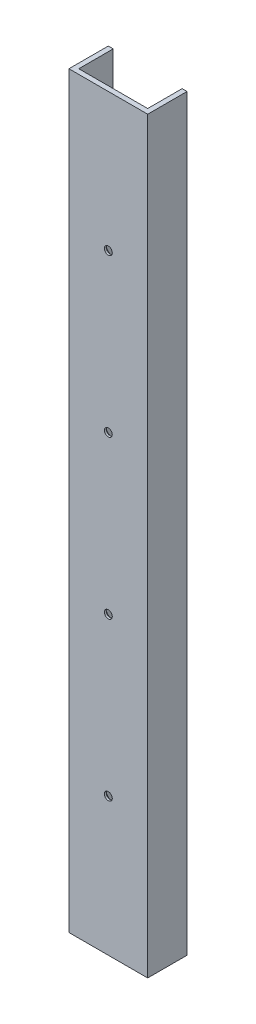
ISO-10303-21;
HEADER;
FILE_DESCRIPTION(('STEP AP214'),'2;1');
FILE_NAME('part.step','',(''),(''),'','','');
FILE_SCHEMA(('AUTOMOTIVE_DESIGN { 1 0 10303 214 1 1 1 1 }'));
ENDSEC;
DATA;
#1=APPLICATION_CONTEXT('core data for automotive mechanical design processes');
#2=APPLICATION_PROTOCOL_DEFINITION('international standard','automotive_design',2000,#1);
#3=PRODUCT_CONTEXT('',#1,'mechanical');
#4=PRODUCT('Part','Part','',(#3));
#5=PRODUCT_RELATED_PRODUCT_CATEGORY('part','',(#4));
#6=PRODUCT_DEFINITION_FORMATION('','',#4);
#7=PRODUCT_DEFINITION_CONTEXT('part definition',#1,'design');
#8=PRODUCT_DEFINITION('design','',#6,#7);
#9=PRODUCT_DEFINITION_SHAPE('','',#8);
#10=(LENGTH_UNIT() NAMED_UNIT(*) SI_UNIT(.MILLI.,.METRE.));
#11=(NAMED_UNIT(*) PLANE_ANGLE_UNIT() SI_UNIT($,.RADIAN.));
#12=(NAMED_UNIT(*) SI_UNIT($,.STERADIAN.) SOLID_ANGLE_UNIT());
#13=UNCERTAINTY_MEASURE_WITH_UNIT(LENGTH_MEASURE(1.E-05),#10,'distance_accuracy_value','');
#14=(GEOMETRIC_REPRESENTATION_CONTEXT(3) GLOBAL_UNCERTAINTY_ASSIGNED_CONTEXT((#13)) GLOBAL_UNIT_ASSIGNED_CONTEXT((#10,
#11,#12)) REPRESENTATION_CONTEXT('',''));
#15=CARTESIAN_POINT('',(0.,0.,0.));
#16=DIRECTION('',(0.,0.,1.));
#17=DIRECTION('',(1.,0.,0.));
#18=AXIS2_PLACEMENT_3D('',#15,#16,#17);
#19=CARTESIAN_POINT('',(-22.2249999999998,241.3,-12.7));
#20=DIRECTION('',(0.,0.,1.));
#21=DIRECTION('',(1.,0.,0.));
#22=AXIS2_PLACEMENT_3D('',#19,#20,#21);
#23=PLANE('',#22);
#24=DIRECTION('',(-1.,0.,0.));
#25=VECTOR('',#24,1.);
#26=CARTESIAN_POINT('',(-22.2250000000002,-241.3,-12.6999999999999));
#27=LINE('',#26,#25);
#28=CARTESIAN_POINT('',(-22.2250000000002,-241.3,-12.6999999999999));
#29=VERTEX_POINT('',#28);
#30=CARTESIAN_POINT('',(-25.4000000000002,-241.3,-12.6999999999999));
#31=VERTEX_POINT('',#30);
#32=EDGE_CURVE('E150',#29,#31,#27,.T.);
#33=ORIENTED_EDGE('',*,*,#32,.T.);
#34=DIRECTION('',(0.,-1.,0.));
#35=VECTOR('',#34,1.);
#36=CARTESIAN_POINT('',(-25.3999999999998,241.3,-12.7));
#37=LINE('',#36,#35);
#38=CARTESIAN_POINT('',(-25.3999999999998,241.3,-12.7));
#39=VERTEX_POINT('',#38);
#40=EDGE_CURVE('E11',#39,#31,#37,.T.);
#41=ORIENTED_EDGE('',*,*,#40,.F.);
#42=DIRECTION('',(-1.,0.,0.));
#43=VECTOR('',#42,1.);
#44=CARTESIAN_POINT('',(-22.2249999999998,241.3,-12.7));
#45=LINE('',#44,#43);
#46=CARTESIAN_POINT('',(-22.2249999999998,241.3,-12.7));
#47=VERTEX_POINT('',#46);
#48=EDGE_CURVE('E173',#47,#39,#45,.T.);
#49=ORIENTED_EDGE('',*,*,#48,.F.);
#50=DIRECTION('',(0.,-1.,0.));
#51=VECTOR('',#50,1.);
#52=CARTESIAN_POINT('',(-22.2249999999998,241.3,-12.7));
#53=LINE('',#52,#51);
#54=EDGE_CURVE('E146',#47,#29,#53,.T.);
#55=ORIENTED_EDGE('',*,*,#54,.T.);
#56=EDGE_LOOP('',(#33,#41,#49,#55));
#57=FACE_BOUND('',#56,.T.);
#58=ADVANCED_FACE('F48',(#57),#23,.F.);
#59=CARTESIAN_POINT('',(-25.3999999999998,241.3,-12.7));
#60=DIRECTION('',(1.,0.,0.));
#61=DIRECTION('',(0.,0.,-1.));
#62=AXIS2_PLACEMENT_3D('',#59,#60,#61);
#63=PLANE('',#62);
#64=DIRECTION('',(0.,0.,1.));
#65=VECTOR('',#64,1.);
#66=CARTESIAN_POINT('',(-25.4000000000002,-241.3,-12.6999999999999));
#67=LINE('',#66,#65);
#68=CARTESIAN_POINT('',(-25.4000000000002,-241.3,12.7));
#69=VERTEX_POINT('',#68);
#70=EDGE_CURVE('E154',#31,#69,#67,.T.);
#71=ORIENTED_EDGE('',*,*,#70,.T.);
#72=DIRECTION('',(0.,-1.,0.));
#73=VECTOR('',#72,1.);
#74=CARTESIAN_POINT('',(-25.3999999999998,241.3,12.6999999999999));
#75=LINE('',#74,#73);
#76=CARTESIAN_POINT('',(-25.3999999999998,241.3,12.6999999999999));
#77=VERTEX_POINT('',#76);
#78=EDGE_CURVE('E57',#77,#69,#75,.T.);
#79=ORIENTED_EDGE('',*,*,#78,.F.);
#80=DIRECTION('',(0.,0.,1.));
#81=VECTOR('',#80,1.);
#82=CARTESIAN_POINT('',(-25.3999999999998,241.3,-12.7));
#83=LINE('',#82,#81);
#84=EDGE_CURVE('E108',#39,#77,#83,.T.);
#85=ORIENTED_EDGE('',*,*,#84,.F.);
#86=ORIENTED_EDGE('',*,*,#40,.T.);
#87=EDGE_LOOP('',(#71,#79,#85,#86));
#88=FACE_BOUND('',#87,.T.);
#89=ADVANCED_FACE('F297',(#88),#63,.F.);
#90=CARTESIAN_POINT('',(-25.3999999999998,241.3,12.6999999999999));
#91=DIRECTION('',(0.,0.,-1.));
#92=DIRECTION('',(-1.,0.,0.));
#93=AXIS2_PLACEMENT_3D('',#90,#91,#92);
#94=PLANE('',#93);
#95=CARTESIAN_POINT('',(0.,152.4,12.7));
#96=DIRECTION('',(0.,0.,-1.));
#97=DIRECTION('',(-1.,0.,0.));
#98=AXIS2_PLACEMENT_3D('',#95,#96,#97);
#99=CIRCLE('',#98,2.5527);
#100=CARTESIAN_POINT('',(-2.5527,152.4,12.7));
#101=VERTEX_POINT('',#100);
#102=EDGE_CURVE('E254',#101,#101,#99,.T.);
#103=ORIENTED_EDGE('',*,*,#102,.T.);
#104=EDGE_LOOP('',(#103));
#105=FACE_BOUND('',#104,.T.);
#106=CARTESIAN_POINT('',(0.,50.8000000000001,12.7));
#107=DIRECTION('',(0.,0.,-1.));
#108=DIRECTION('',(-1.,0.,0.));
#109=AXIS2_PLACEMENT_3D('',#106,#107,#108);
#110=CIRCLE('',#109,2.5527);
#111=CARTESIAN_POINT('',(-2.5527,50.8000000000001,12.7));
#112=VERTEX_POINT('',#111);
#113=EDGE_CURVE('E242',#112,#112,#110,.T.);
#114=ORIENTED_EDGE('',*,*,#113,.T.);
#115=EDGE_LOOP('',(#114));
#116=FACE_BOUND('',#115,.T.);
#117=CARTESIAN_POINT('',(0.,-50.7999999999999,12.6999999999999));
#118=DIRECTION('',(0.,0.,-1.));
#119=DIRECTION('',(-1.,0.,0.));
#120=AXIS2_PLACEMENT_3D('',#117,#118,#119);
#121=CIRCLE('',#120,2.5527);
#122=CARTESIAN_POINT('',(-2.5527,-50.7999999999999,12.6999999999999));
#123=VERTEX_POINT('',#122);
#124=EDGE_CURVE('E230',#123,#123,#121,.T.);
#125=ORIENTED_EDGE('',*,*,#124,.T.);
#126=EDGE_LOOP('',(#125));
#127=FACE_BOUND('',#126,.T.);
#128=CARTESIAN_POINT('',(0.,-152.4,12.7));
#129=DIRECTION('',(0.,0.,-1.));
#130=DIRECTION('',(-1.,0.,0.));
#131=AXIS2_PLACEMENT_3D('',#128,#129,#130);
#132=CIRCLE('',#131,2.5527);
#133=CARTESIAN_POINT('',(-2.5527,-152.4,12.7));
#134=VERTEX_POINT('',#133);
#135=EDGE_CURVE('E155',#134,#134,#132,.T.);
#136=ORIENTED_EDGE('',*,*,#135,.T.);
#137=EDGE_LOOP('',(#136));
#138=FACE_BOUND('',#137,.T.);
#139=DIRECTION('',(1.,0.,0.));
#140=VECTOR('',#139,1.);
#141=CARTESIAN_POINT('',(-25.4000000000002,-241.3,12.7));
#142=LINE('',#141,#140);
#143=CARTESIAN_POINT('',(25.4000000000002,-241.3,12.7));
#144=VERTEX_POINT('',#143);
#145=EDGE_CURVE('E158',#69,#144,#142,.T.);
#146=ORIENTED_EDGE('',*,*,#145,.T.);
#147=DIRECTION('',(0.,-1.,0.));
#148=VECTOR('',#147,1.);
#149=CARTESIAN_POINT('',(25.3999999999998,241.3,12.6999999999999));
#150=LINE('',#149,#148);
#151=CARTESIAN_POINT('',(25.3999999999998,241.3,12.6999999999999));
#152=VERTEX_POINT('',#151);
#153=EDGE_CURVE('E184',#152,#144,#150,.T.);
#154=ORIENTED_EDGE('',*,*,#153,.F.);
#155=DIRECTION('',(1.,0.,0.));
#156=VECTOR('',#155,1.);
#157=CARTESIAN_POINT('',(-25.3999999999998,241.3,12.6999999999999));
#158=LINE('',#157,#156);
#159=EDGE_CURVE('E195',#77,#152,#158,.T.);
#160=ORIENTED_EDGE('',*,*,#159,.F.);
#161=ORIENTED_EDGE('',*,*,#78,.T.);
#162=EDGE_LOOP('',(#146,#154,#160,#161));
#163=FACE_BOUND('',#162,.T.);
#164=ADVANCED_FACE('F193',(#105,#116,#127,#138,#163),#94,.F.);
#165=CARTESIAN_POINT('',(25.3999999999998,241.3,12.6999999999999));
#166=DIRECTION('',(-1.,0.,0.));
#167=DIRECTION('',(0.,0.,1.));
#168=AXIS2_PLACEMENT_3D('',#165,#166,#167);
#169=PLANE('',#168);
#170=DIRECTION('',(0.,0.,-1.));
#171=VECTOR('',#170,1.);
#172=CARTESIAN_POINT('',(25.4000000000002,-241.3,12.7));
#173=LINE('',#172,#171);
#174=CARTESIAN_POINT('',(25.4000000000002,-241.3,-12.6999999999999));
#175=VERTEX_POINT('',#174);
#176=EDGE_CURVE('E161',#144,#175,#173,.T.);
#177=ORIENTED_EDGE('',*,*,#176,.T.);
#178=DIRECTION('',(0.,-1.,0.));
#179=VECTOR('',#178,1.);
#180=CARTESIAN_POINT('',(25.3999999999998,241.3,-12.7));
#181=LINE('',#180,#179);
#182=CARTESIAN_POINT('',(25.3999999999998,241.3,-12.7));
#183=VERTEX_POINT('',#182);
#184=EDGE_CURVE('E180',#183,#175,#181,.T.);
#185=ORIENTED_EDGE('',*,*,#184,.F.);
#186=DIRECTION('',(0.,0.,-1.));
#187=VECTOR('',#186,1.);
#188=CARTESIAN_POINT('',(25.3999999999998,241.3,12.6999999999999));
#189=LINE('',#188,#187);
#190=EDGE_CURVE('E208',#152,#183,#189,.T.);
#191=ORIENTED_EDGE('',*,*,#190,.F.);
#192=ORIENTED_EDGE('',*,*,#153,.T.);
#193=EDGE_LOOP('',(#177,#185,#191,#192));
#194=FACE_BOUND('',#193,.T.);
#195=ADVANCED_FACE('F203',(#194),#169,.F.);
#196=CARTESIAN_POINT('',(25.3999999999998,241.3,-12.7));
#197=DIRECTION('',(0.,0.,1.));
#198=DIRECTION('',(1.,0.,0.));
#199=AXIS2_PLACEMENT_3D('',#196,#197,#198);
#200=PLANE('',#199);
#201=DIRECTION('',(-1.,0.,0.));
#202=VECTOR('',#201,1.);
#203=CARTESIAN_POINT('',(25.4000000000002,-241.3,-12.6999999999999));
#204=LINE('',#203,#202);
#205=CARTESIAN_POINT('',(22.2250000000002,-241.3,-12.6999999999999));
#206=VERTEX_POINT('',#205);
#207=EDGE_CURVE('E164',#175,#206,#204,.T.);
#208=ORIENTED_EDGE('',*,*,#207,.T.);
#209=DIRECTION('',(0.,-1.,0.));
#210=VECTOR('',#209,1.);
#211=CARTESIAN_POINT('',(22.2249999999998,241.3,-12.7));
#212=LINE('',#211,#210);
#213=CARTESIAN_POINT('',(22.2249999999998,241.3,-12.7));
#214=VERTEX_POINT('',#213);
#215=EDGE_CURVE('E138',#214,#206,#212,.T.);
#216=ORIENTED_EDGE('',*,*,#215,.F.);
#217=DIRECTION('',(-1.,0.,0.));
#218=VECTOR('',#217,1.);
#219=CARTESIAN_POINT('',(25.3999999999998,241.3,-12.7));
#220=LINE('',#219,#218);
#221=EDGE_CURVE('E127',#183,#214,#220,.T.);
#222=ORIENTED_EDGE('',*,*,#221,.F.);
#223=ORIENTED_EDGE('',*,*,#184,.T.);
#224=EDGE_LOOP('',(#208,#216,#222,#223));
#225=FACE_BOUND('',#224,.T.);
#226=ADVANCED_FACE('F206',(#225),#200,.F.);
#227=CARTESIAN_POINT('',(22.2249999999998,241.3,-12.7));
#228=DIRECTION('',(1.,0.,0.));
#229=DIRECTION('',(0.,0.,-1.));
#230=AXIS2_PLACEMENT_3D('',#227,#228,#229);
#231=PLANE('',#230);
#232=DIRECTION('',(0.,0.,1.));
#233=VECTOR('',#232,1.);
#234=CARTESIAN_POINT('',(22.2250000000002,-241.3,-12.6999999999999));
#235=LINE('',#234,#233);
#236=CARTESIAN_POINT('',(22.2250000000002,-241.3,9.52500000000001));
#237=VERTEX_POINT('',#236);
#238=EDGE_CURVE('E136',#206,#237,#235,.T.);
#239=ORIENTED_EDGE('',*,*,#238,.T.);
#240=DIRECTION('',(0.,-1.,0.));
#241=VECTOR('',#240,1.);
#242=CARTESIAN_POINT('',(22.2249999999998,241.3,9.52500000000001));
#243=LINE('',#242,#241);
#244=CARTESIAN_POINT('',(22.2249999999998,241.3,9.52500000000001));
#245=VERTEX_POINT('',#244);
#246=EDGE_CURVE('E133',#245,#237,#243,.T.);
#247=ORIENTED_EDGE('',*,*,#246,.F.);
#248=DIRECTION('',(0.,0.,1.));
#249=VECTOR('',#248,1.);
#250=CARTESIAN_POINT('',(22.2249999999998,241.3,-12.7));
#251=LINE('',#250,#249);
#252=EDGE_CURVE('E121',#214,#245,#251,.T.);
#253=ORIENTED_EDGE('',*,*,#252,.F.);
#254=ORIENTED_EDGE('',*,*,#215,.T.);
#255=EDGE_LOOP('',(#239,#247,#253,#254));
#256=FACE_BOUND('',#255,.T.);
#257=ADVANCED_FACE('F134',(#256),#231,.F.);
#258=CARTESIAN_POINT('',(22.2249999999998,241.3,9.52500000000001));
#259=DIRECTION('',(0.,0.,1.));
#260=DIRECTION('',(1.,0.,0.));
#261=AXIS2_PLACEMENT_3D('',#258,#259,#260);
#262=PLANE('',#261);
#263=CARTESIAN_POINT('',(0.,152.4,9.52500000000001));
#264=DIRECTION('',(0.,0.,-1.));
#265=DIRECTION('',(-1.,0.,0.));
#266=AXIS2_PLACEMENT_3D('',#263,#264,#265);
#267=CIRCLE('',#266,4.8895);
#268=CARTESIAN_POINT('',(-4.8895,152.4,9.52500000000001));
#269=VERTEX_POINT('',#268);
#270=EDGE_CURVE('E262',#269,#269,#267,.T.);
#271=ORIENTED_EDGE('',*,*,#270,.F.);
#272=EDGE_LOOP('',(#271));
#273=FACE_BOUND('',#272,.T.);
#274=CARTESIAN_POINT('',(0.,50.8000000000001,9.52500000000001));
#275=DIRECTION('',(0.,0.,-1.));
#276=DIRECTION('',(-1.,0.,0.));
#277=AXIS2_PLACEMENT_3D('',#274,#275,#276);
#278=CIRCLE('',#277,4.8895);
#279=CARTESIAN_POINT('',(-4.8895,50.8000000000001,9.52500000000001));
#280=VERTEX_POINT('',#279);
#281=EDGE_CURVE('E250',#280,#280,#278,.T.);
#282=ORIENTED_EDGE('',*,*,#281,.F.);
#283=EDGE_LOOP('',(#282));
#284=FACE_BOUND('',#283,.T.);
#285=CARTESIAN_POINT('',(0.,-50.7999999999999,9.52500000000001));
#286=DIRECTION('',(0.,0.,-1.));
#287=DIRECTION('',(-1.,0.,0.));
#288=AXIS2_PLACEMENT_3D('',#285,#286,#287);
#289=CIRCLE('',#288,4.8895);
#290=CARTESIAN_POINT('',(-4.8895,-50.7999999999999,9.52500000000001));
#291=VERTEX_POINT('',#290);
#292=EDGE_CURVE('E238',#291,#291,#289,.T.);
#293=ORIENTED_EDGE('',*,*,#292,.F.);
#294=EDGE_LOOP('',(#293));
#295=FACE_BOUND('',#294,.T.);
#296=CARTESIAN_POINT('',(0.,-152.4,9.52500000000001));
#297=DIRECTION('',(0.,0.,-1.));
#298=DIRECTION('',(-1.,0.,0.));
#299=AXIS2_PLACEMENT_3D('',#296,#297,#298);
#300=CIRCLE('',#299,4.8895);
#301=CARTESIAN_POINT('',(-4.8895,-152.4,9.52500000000001));
#302=VERTEX_POINT('',#301);
#303=EDGE_CURVE('E226',#302,#302,#300,.T.);
#304=ORIENTED_EDGE('',*,*,#303,.F.);
#305=EDGE_LOOP('',(#304));
#306=FACE_BOUND('',#305,.T.);
#307=DIRECTION('',(-1.,0.,0.));
#308=VECTOR('',#307,1.);
#309=CARTESIAN_POINT('',(22.2250000000002,-241.3,9.52500000000001));
#310=LINE('',#309,#308);
#311=CARTESIAN_POINT('',(-22.2250000000002,-241.3,9.52500000000001));
#312=VERTEX_POINT('',#311);
#313=EDGE_CURVE('E94',#237,#312,#310,.T.);
#314=ORIENTED_EDGE('',*,*,#313,.T.);
#315=DIRECTION('',(0.,-1.,0.));
#316=VECTOR('',#315,1.);
#317=CARTESIAN_POINT('',(-22.2249999999998,241.3,9.52500000000001));
#318=LINE('',#317,#316);
#319=CARTESIAN_POINT('',(-22.2249999999998,241.3,9.52500000000001));
#320=VERTEX_POINT('',#319);
#321=EDGE_CURVE('E139',#320,#312,#318,.T.);
#322=ORIENTED_EDGE('',*,*,#321,.F.);
#323=DIRECTION('',(-1.,0.,0.));
#324=VECTOR('',#323,1.);
#325=CARTESIAN_POINT('',(22.2249999999998,241.3,9.52500000000001));
#326=LINE('',#325,#324);
#327=EDGE_CURVE('E125',#245,#320,#326,.T.);
#328=ORIENTED_EDGE('',*,*,#327,.F.);
#329=ORIENTED_EDGE('',*,*,#246,.T.);
#330=EDGE_LOOP('',(#314,#322,#328,#329));
#331=FACE_BOUND('',#330,.T.);
#332=ADVANCED_FACE('F141',(#273,#284,#295,#306,#331),#262,.F.);
#333=CARTESIAN_POINT('',(-22.2249999999998,241.3,9.52500000000001));
#334=DIRECTION('',(-1.,0.,0.));
#335=DIRECTION('',(0.,0.,1.));
#336=AXIS2_PLACEMENT_3D('',#333,#334,#335);
#337=PLANE('',#336);
#338=DIRECTION('',(0.,0.,-1.));
#339=VECTOR('',#338,1.);
#340=CARTESIAN_POINT('',(-22.2250000000002,-241.3,9.52500000000001));
#341=LINE('',#340,#339);
#342=EDGE_CURVE('E100',#312,#29,#341,.T.);
#343=ORIENTED_EDGE('',*,*,#342,.T.);
#344=ORIENTED_EDGE('',*,*,#54,.F.);
#345=DIRECTION('',(0.,0.,-1.));
#346=VECTOR('',#345,1.);
#347=CARTESIAN_POINT('',(-22.2249999999998,241.3,9.52500000000001));
#348=LINE('',#347,#346);
#349=EDGE_CURVE('E65',#320,#47,#348,.T.);
#350=ORIENTED_EDGE('',*,*,#349,.F.);
#351=ORIENTED_EDGE('',*,*,#321,.T.);
#352=EDGE_LOOP('',(#343,#344,#350,#351));
#353=FACE_BOUND('',#352,.T.);
#354=ADVANCED_FACE('F272',(#353),#337,.F.);
#355=CARTESIAN_POINT('',(0.,241.3,0.));
#356=DIRECTION('',(0.,1.,0.));
#357=DIRECTION('',(0.,0.,1.));
#358=AXIS2_PLACEMENT_3D('',#355,#356,#357);
#359=PLANE('',#358);
#360=ORIENTED_EDGE('',*,*,#48,.T.);
#361=ORIENTED_EDGE('',*,*,#84,.T.);
#362=ORIENTED_EDGE('',*,*,#159,.T.);
#363=ORIENTED_EDGE('',*,*,#190,.T.);
#364=ORIENTED_EDGE('',*,*,#221,.T.);
#365=ORIENTED_EDGE('',*,*,#252,.T.);
#366=ORIENTED_EDGE('',*,*,#327,.T.);
#367=ORIENTED_EDGE('',*,*,#349,.T.);
#368=EDGE_LOOP('',(#360,#361,#362,#363,#364,#365,#366,#367));
#369=FACE_BOUND('',#368,.T.);
#370=ADVANCED_FACE('F123',(#369),#359,.T.);
#371=CARTESIAN_POINT('',(0.,-241.3,0.));
#372=DIRECTION('',(0.,1.,0.));
#373=DIRECTION('',(0.,0.,1.));
#374=AXIS2_PLACEMENT_3D('',#371,#372,#373);
#375=PLANE('',#374);
#376=ORIENTED_EDGE('',*,*,#32,.F.);
#377=ORIENTED_EDGE('',*,*,#342,.F.);
#378=ORIENTED_EDGE('',*,*,#313,.F.);
#379=ORIENTED_EDGE('',*,*,#238,.F.);
#380=ORIENTED_EDGE('',*,*,#207,.F.);
#381=ORIENTED_EDGE('',*,*,#176,.F.);
#382=ORIENTED_EDGE('',*,*,#145,.F.);
#383=ORIENTED_EDGE('',*,*,#70,.F.);
#384=EDGE_LOOP('',(#376,#377,#378,#379,#380,#381,#382,#383));
#385=FACE_BOUND('',#384,.T.);
#386=ADVANCED_FACE('F199',(#385),#375,.F.);
#387=CARTESIAN_POINT('',(0.,-152.4,9.52500000000001));
#388=DIRECTION('',(0.,0.,-1.));
#389=DIRECTION('',(-1.,0.,0.));
#390=AXIS2_PLACEMENT_3D('',#387,#388,#389);
#391=CYLINDRICAL_SURFACE('',#390,2.5527);
#392=ORIENTED_EDGE('',*,*,#135,.F.);
#393=EDGE_LOOP('',(#392));
#394=FACE_BOUND('',#393,.T.);
#395=CARTESIAN_POINT('',(0.,-152.4,11.485808018135));
#396=DIRECTION('',(0.,0.,-1.));
#397=DIRECTION('',(-1.,0.,0.));
#398=AXIS2_PLACEMENT_3D('',#395,#396,#397);
#399=CIRCLE('',#398,2.5527);
#400=CARTESIAN_POINT('',(-2.5527,-152.4,11.485808018135));
#401=VERTEX_POINT('',#400);
#402=EDGE_CURVE('E222',#401,#401,#399,.T.);
#403=ORIENTED_EDGE('',*,*,#402,.T.);
#404=EDGE_LOOP('',(#403));
#405=FACE_BOUND('',#404,.T.);
#406=ADVANCED_FACE('F283',(#394,#405),#391,.F.);
#407=CARTESIAN_POINT('',(0.,-152.4,9.52500000000001));
#408=DIRECTION('',(0.,0.,-1.));
#409=DIRECTION('',(-1.,0.,0.));
#410=AXIS2_PLACEMENT_3D('',#407,#408,#409);
#411=CONICAL_SURFACE('',#410,4.8895,0.872664625997165);
#412=ORIENTED_EDGE('',*,*,#402,.F.);
#413=EDGE_LOOP('',(#412));
#414=FACE_BOUND('',#413,.T.);
#415=ORIENTED_EDGE('',*,*,#303,.T.);
#416=EDGE_LOOP('',(#415));
#417=FACE_BOUND('',#416,.T.);
#418=ADVANCED_FACE('F280',(#414,#417),#411,.F.);
#419=CARTESIAN_POINT('',(0.,-50.7999999999999,9.52500000000001));
#420=DIRECTION('',(0.,0.,-1.));
#421=DIRECTION('',(-1.,0.,0.));
#422=AXIS2_PLACEMENT_3D('',#419,#420,#421);
#423=CYLINDRICAL_SURFACE('',#422,2.5527);
#424=ORIENTED_EDGE('',*,*,#124,.F.);
#425=EDGE_LOOP('',(#424));
#426=FACE_BOUND('',#425,.T.);
#427=CARTESIAN_POINT('',(0.,-50.7999999999999,11.485808018135));
#428=DIRECTION('',(0.,0.,-1.));
#429=DIRECTION('',(-1.,0.,0.));
#430=AXIS2_PLACEMENT_3D('',#427,#428,#429);
#431=CIRCLE('',#430,2.5527);
#432=CARTESIAN_POINT('',(-2.5527,-50.7999999999999,11.485808018135));
#433=VERTEX_POINT('',#432);
#434=EDGE_CURVE('E234',#433,#433,#431,.T.);
#435=ORIENTED_EDGE('',*,*,#434,.T.);
#436=EDGE_LOOP('',(#435));
#437=FACE_BOUND('',#436,.T.);
#438=ADVANCED_FACE('F282',(#426,#437),#423,.F.);
#439=CARTESIAN_POINT('',(0.,-50.7999999999999,9.52500000000001));
#440=DIRECTION('',(0.,0.,-1.));
#441=DIRECTION('',(-1.,0.,0.));
#442=AXIS2_PLACEMENT_3D('',#439,#440,#441);
#443=CONICAL_SURFACE('',#442,4.8895,0.872664625997165);
#444=ORIENTED_EDGE('',*,*,#434,.F.);
#445=EDGE_LOOP('',(#444));
#446=FACE_BOUND('',#445,.T.);
#447=ORIENTED_EDGE('',*,*,#292,.T.);
#448=EDGE_LOOP('',(#447));
#449=FACE_BOUND('',#448,.T.);
#450=ADVANCED_FACE('F290',(#446,#449),#443,.F.);
#451=CARTESIAN_POINT('',(0.,50.8000000000001,9.52500000000001));
#452=DIRECTION('',(0.,0.,-1.));
#453=DIRECTION('',(-1.,0.,0.));
#454=AXIS2_PLACEMENT_3D('',#451,#452,#453);
#455=CYLINDRICAL_SURFACE('',#454,2.5527);
#456=ORIENTED_EDGE('',*,*,#113,.F.);
#457=EDGE_LOOP('',(#456));
#458=FACE_BOUND('',#457,.T.);
#459=CARTESIAN_POINT('',(0.,50.8000000000001,11.4858080181351));
#460=DIRECTION('',(0.,0.,-1.));
#461=DIRECTION('',(-1.,0.,0.));
#462=AXIS2_PLACEMENT_3D('',#459,#460,#461);
#463=CIRCLE('',#462,2.5527);
#464=CARTESIAN_POINT('',(-2.5527,50.8000000000001,11.4858080181351));
#465=VERTEX_POINT('',#464);
#466=EDGE_CURVE('E246',#465,#465,#463,.T.);
#467=ORIENTED_EDGE('',*,*,#466,.T.);
#468=EDGE_LOOP('',(#467));
#469=FACE_BOUND('',#468,.T.);
#470=ADVANCED_FACE('F335',(#458,#469),#455,.F.);
#471=CARTESIAN_POINT('',(0.,50.8000000000001,9.52500000000001));
#472=DIRECTION('',(0.,0.,-1.));
#473=DIRECTION('',(-1.,0.,0.));
#474=AXIS2_PLACEMENT_3D('',#471,#472,#473);
#475=CONICAL_SURFACE('',#474,4.8895,0.872664625997165);
#476=ORIENTED_EDGE('',*,*,#466,.F.);
#477=EDGE_LOOP('',(#476));
#478=FACE_BOUND('',#477,.T.);
#479=ORIENTED_EDGE('',*,*,#281,.T.);
#480=EDGE_LOOP('',(#479));
#481=FACE_BOUND('',#480,.T.);
#482=ADVANCED_FACE('F340',(#478,#481),#475,.F.);
#483=CARTESIAN_POINT('',(0.,152.4,9.52500000000001));
#484=DIRECTION('',(0.,0.,-1.));
#485=DIRECTION('',(-1.,0.,0.));
#486=AXIS2_PLACEMENT_3D('',#483,#484,#485);
#487=CYLINDRICAL_SURFACE('',#486,2.5527);
#488=ORIENTED_EDGE('',*,*,#102,.F.);
#489=EDGE_LOOP('',(#488));
#490=FACE_BOUND('',#489,.T.);
#491=CARTESIAN_POINT('',(0.,152.4,11.485808018135));
#492=DIRECTION('',(0.,0.,-1.));
#493=DIRECTION('',(-1.,0.,0.));
#494=AXIS2_PLACEMENT_3D('',#491,#492,#493);
#495=CIRCLE('',#494,2.5527);
#496=CARTESIAN_POINT('',(-2.5527,152.4,11.485808018135));
#497=VERTEX_POINT('',#496);
#498=EDGE_CURVE('E258',#497,#497,#495,.T.);
#499=ORIENTED_EDGE('',*,*,#498,.T.);
#500=EDGE_LOOP('',(#499));
#501=FACE_BOUND('',#500,.T.);
#502=ADVANCED_FACE('F346',(#490,#501),#487,.F.);
#503=CARTESIAN_POINT('',(0.,152.4,9.52500000000001));
#504=DIRECTION('',(0.,0.,-1.));
#505=DIRECTION('',(-1.,0.,0.));
#506=AXIS2_PLACEMENT_3D('',#503,#504,#505);
#507=CONICAL_SURFACE('',#506,4.8895,0.872664625997165);
#508=ORIENTED_EDGE('',*,*,#498,.F.);
#509=EDGE_LOOP('',(#508));
#510=FACE_BOUND('',#509,.T.);
#511=ORIENTED_EDGE('',*,*,#270,.T.);
#512=EDGE_LOOP('',(#511));
#513=FACE_BOUND('',#512,.T.);
#514=ADVANCED_FACE('F268',(#510,#513),#507,.F.);
#515=CLOSED_SHELL('',(#58,#89,#164,#195,#226,#257,#332,#354,#370,#386,#406,#418,#438,#450,#470,
#482,#502,#514));
#516=MANIFOLD_SOLID_BREP('B2',#515);
#517=ADVANCED_BREP_SHAPE_REPRESENTATION('',(#18,#516),#14);
#518=SHAPE_DEFINITION_REPRESENTATION(#9,#517);
ENDSEC;
END-ISO-10303-21;
